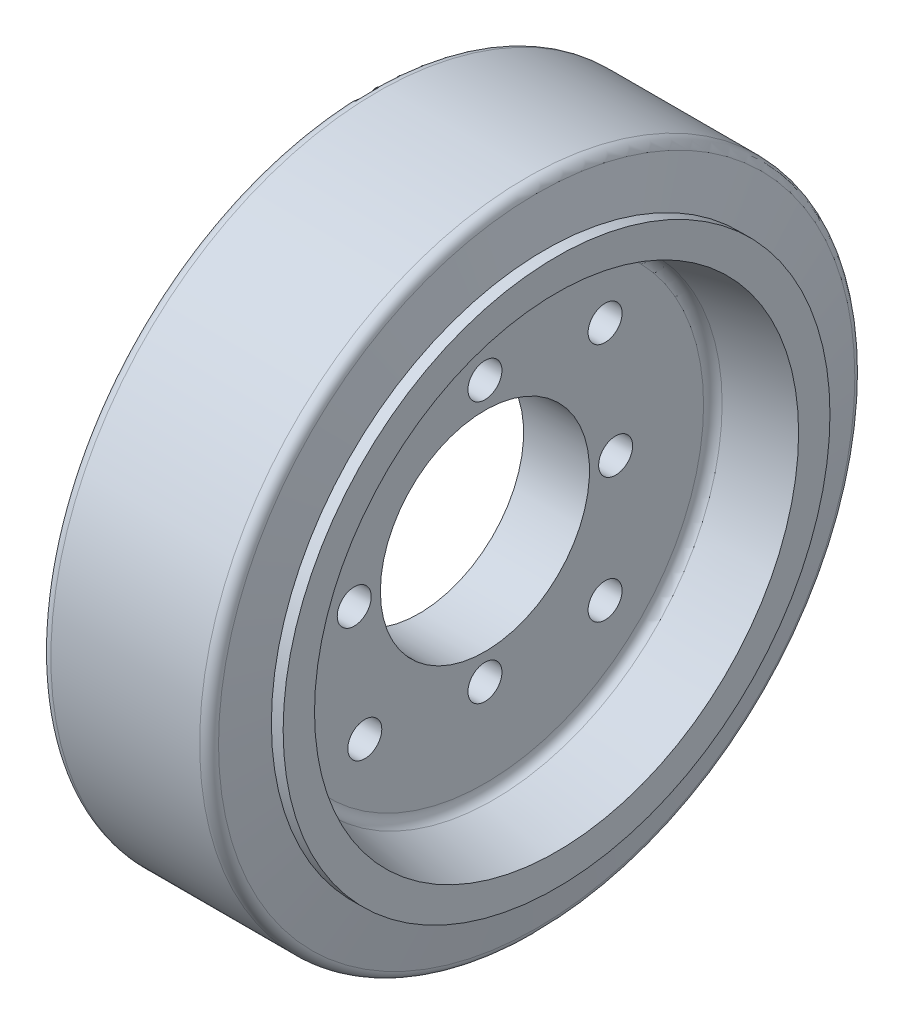
ISO-10303-21;
HEADER;
FILE_DESCRIPTION(('STEP AP214'),'2;1');
FILE_NAME('part.step','',(''),(''),'','','');
FILE_SCHEMA(('AUTOMOTIVE_DESIGN { 1 0 10303 214 1 1 1 1 }'));
ENDSEC;
DATA;
#1=APPLICATION_CONTEXT('core data for automotive mechanical design processes');
#2=APPLICATION_PROTOCOL_DEFINITION('international standard','automotive_design',2000,#1);
#3=PRODUCT_CONTEXT('',#1,'mechanical');
#4=PRODUCT('Part','Part','',(#3));
#5=PRODUCT_RELATED_PRODUCT_CATEGORY('part','',(#4));
#6=PRODUCT_DEFINITION_FORMATION('','',#4);
#7=PRODUCT_DEFINITION_CONTEXT('part definition',#1,'design');
#8=PRODUCT_DEFINITION('design','',#6,#7);
#9=PRODUCT_DEFINITION_SHAPE('','',#8);
#10=(LENGTH_UNIT() NAMED_UNIT(*) SI_UNIT(.MILLI.,.METRE.));
#11=(NAMED_UNIT(*) PLANE_ANGLE_UNIT() SI_UNIT($,.RADIAN.));
#12=(NAMED_UNIT(*) SI_UNIT($,.STERADIAN.) SOLID_ANGLE_UNIT());
#13=UNCERTAINTY_MEASURE_WITH_UNIT(LENGTH_MEASURE(1.E-05),#10,'distance_accuracy_value','');
#14=(GEOMETRIC_REPRESENTATION_CONTEXT(3) GLOBAL_UNCERTAINTY_ASSIGNED_CONTEXT((#13)) GLOBAL_UNIT_ASSIGNED_CONTEXT((#10,
#11,#12)) REPRESENTATION_CONTEXT('',''));
#15=CARTESIAN_POINT('',(0.,0.,0.));
#16=DIRECTION('',(0.,0.,1.));
#17=DIRECTION('',(1.,0.,0.));
#18=AXIS2_PLACEMENT_3D('',#15,#16,#17);
#19=CARTESIAN_POINT('',(15.9,0.,0.));
#20=DIRECTION('',(-1.,0.,0.));
#21=DIRECTION('',(0.,0.,1.));
#22=AXIS2_PLACEMENT_3D('',#19,#20,#21);
#23=CONICAL_SURFACE('',#22,62.5,1.39137423336047);
#24=CARTESIAN_POINT('',(16.1980092545903,0.,0.));
#25=DIRECTION('',(1.,0.,0.));
#26=DIRECTION('',(0.,0.,-1.));
#27=AXIS2_PLACEMENT_3D('',#24,#25,#26);
#28=CIRCLE('',#27,60.8569219476642);
#29=CARTESIAN_POINT('',(16.1980092545903,0.,-60.8569219476642));
#30=VERTEX_POINT('',#29);
#31=EDGE_CURVE('E12',#30,#30,#28,.T.);
#32=ORIENTED_EDGE('',*,*,#31,.T.);
#33=EDGE_LOOP('',(#32));
#34=FACE_BOUND('',#33,.T.);
#35=CARTESIAN_POINT('',(17.75,0.,0.));
#36=DIRECTION('',(-1.,0.,0.));
#37=DIRECTION('',(0.,0.,1.));
#38=AXIS2_PLACEMENT_3D('',#35,#36,#37);
#39=CIRCLE('',#38,52.3);
#40=CARTESIAN_POINT('',(17.75,0.,52.3));
#41=VERTEX_POINT('',#40);
#42=EDGE_CURVE('E91',#41,#41,#39,.T.);
#43=ORIENTED_EDGE('',*,*,#42,.T.);
#44=EDGE_LOOP('',(#43));
#45=FACE_BOUND('',#44,.T.);
#46=ADVANCED_FACE('F52',(#34,#45),#23,.T.);
#47=CARTESIAN_POINT('',(0.,0.,0.));
#48=DIRECTION('',(-1.,0.,0.));
#49=DIRECTION('',(0.,0.,1.));
#50=AXIS2_PLACEMENT_3D('',#47,#48,#49);
#51=CYLINDRICAL_SURFACE('',#50,52.3);
#52=CARTESIAN_POINT('',(20.,0.,0.));
#53=DIRECTION('',(-1.,0.,0.));
#54=DIRECTION('',(0.,0.,1.));
#55=AXIS2_PLACEMENT_3D('',#52,#53,#54);
#56=CIRCLE('',#55,52.3);
#57=CARTESIAN_POINT('',(20.,0.,52.3));
#58=VERTEX_POINT('',#57);
#59=EDGE_CURVE('E95',#58,#58,#56,.T.);
#60=ORIENTED_EDGE('',*,*,#59,.T.);
#61=EDGE_LOOP('',(#60));
#62=FACE_BOUND('',#61,.T.);
#63=ORIENTED_EDGE('',*,*,#42,.F.);
#64=EDGE_LOOP('',(#63));
#65=FACE_BOUND('',#64,.T.);
#66=ADVANCED_FACE('F214',(#62,#65),#51,.T.);
#67=CARTESIAN_POINT('',(20.,-52.3,0.));
#68=DIRECTION('',(1.,0.,0.));
#69=DIRECTION('',(0.,0.,-1.));
#70=AXIS2_PLACEMENT_3D('',#67,#68,#69);
#71=PLANE('',#70);
#72=CARTESIAN_POINT('',(20.,0.,0.));
#73=DIRECTION('',(-1.,0.,0.));
#74=DIRECTION('',(0.,0.,1.));
#75=AXIS2_PLACEMENT_3D('',#72,#73,#74);
#76=CIRCLE('',#75,46.3);
#77=CARTESIAN_POINT('',(20.,0.,46.3));
#78=VERTEX_POINT('',#77);
#79=EDGE_CURVE('E99',#78,#78,#76,.T.);
#80=ORIENTED_EDGE('',*,*,#79,.T.);
#81=EDGE_LOOP('',(#80));
#82=FACE_BOUND('',#81,.T.);
#83=ORIENTED_EDGE('',*,*,#59,.F.);
#84=EDGE_LOOP('',(#83));
#85=FACE_BOUND('',#84,.T.);
#86=ADVANCED_FACE('F220',(#82,#85),#71,.T.);
#87=CARTESIAN_POINT('',(20.,0.,0.));
#88=DIRECTION('',(1.,0.,0.));
#89=DIRECTION('',(0.,0.,-1.));
#90=AXIS2_PLACEMENT_3D('',#87,#88,#89);
#91=CONICAL_SURFACE('',#90,46.3,0.205103886501625);
#92=CARTESIAN_POINT('',(7.89266225994668,0.,0.));
#93=DIRECTION('',(1.,0.,0.));
#94=DIRECTION('',(0.,0.,-1.));
#95=AXIS2_PLACEMENT_3D('',#92,#93,#94);
#96=CIRCLE('',#95,43.7813202511568);
#97=CARTESIAN_POINT('',(7.89266225994668,0.,-43.7813202511568));
#98=VERTEX_POINT('',#97);
#99=EDGE_CURVE('E87',#98,#98,#96,.F.);
#100=ORIENTED_EDGE('',*,*,#99,.T.);
#101=EDGE_LOOP('',(#100));
#102=FACE_BOUND('',#101,.T.);
#103=ORIENTED_EDGE('',*,*,#79,.F.);
#104=EDGE_LOOP('',(#103));
#105=FACE_BOUND('',#104,.T.);
#106=ADVANCED_FACE('F227',(#102,#105),#91,.F.);
#107=CARTESIAN_POINT('',(6.3,-43.45,0.));
#108=DIRECTION('',(1.,0.,0.));
#109=DIRECTION('',(0.,0.,-1.));
#110=AXIS2_PLACEMENT_3D('',#107,#108,#109);
#111=PLANE('',#110);
#112=CARTESIAN_POINT('',(6.3,22.9809703885627,-22.9809703885629));
#113=DIRECTION('',(1.,0.,0.));
#114=DIRECTION('',(0.,0.,-1.));
#115=AXIS2_PLACEMENT_3D('',#112,#113,#114);
#116=CIRCLE('',#115,3.24999999999999);
#117=CARTESIAN_POINT('',(6.3,22.9809703885627,-26.2309703885629));
#118=VERTEX_POINT('',#117);
#119=EDGE_CURVE('E163',#118,#118,#116,.T.);
#120=ORIENTED_EDGE('',*,*,#119,.F.);
#121=EDGE_LOOP('',(#120));
#122=FACE_BOUND('',#121,.T.);
#123=CARTESIAN_POINT('',(6.3,-22.9809703885629,-22.9809703885627));
#124=DIRECTION('',(1.,0.,0.));
#125=DIRECTION('',(0.,0.,-1.));
#126=AXIS2_PLACEMENT_3D('',#123,#124,#125);
#127=CIRCLE('',#126,3.24999999999999);
#128=CARTESIAN_POINT('',(6.3,-22.9809703885629,-26.2309703885627));
#129=VERTEX_POINT('',#128);
#130=EDGE_CURVE('E157',#129,#129,#127,.T.);
#131=ORIENTED_EDGE('',*,*,#130,.F.);
#132=EDGE_LOOP('',(#131));
#133=FACE_BOUND('',#132,.T.);
#134=CARTESIAN_POINT('',(6.3,-22.9809703885627,22.9809703885629));
#135=DIRECTION('',(1.,0.,0.));
#136=DIRECTION('',(0.,0.,-1.));
#137=AXIS2_PLACEMENT_3D('',#134,#135,#136);
#138=CIRCLE('',#137,3.24999999999999);
#139=CARTESIAN_POINT('',(6.3,-22.9809703885627,19.7309703885629));
#140=VERTEX_POINT('',#139);
#141=EDGE_CURVE('E151',#140,#140,#138,.T.);
#142=ORIENTED_EDGE('',*,*,#141,.F.);
#143=EDGE_LOOP('',(#142));
#144=FACE_BOUND('',#143,.T.);
#145=CARTESIAN_POINT('',(6.3,22.9809703885629,22.9809703885627));
#146=DIRECTION('',(1.,0.,0.));
#147=DIRECTION('',(0.,0.,-1.));
#148=AXIS2_PLACEMENT_3D('',#145,#146,#147);
#149=CIRCLE('',#148,3.24999999999999);
#150=CARTESIAN_POINT('',(6.3,22.9809703885629,19.7309703885627));
#151=VERTEX_POINT('',#150);
#152=EDGE_CURVE('E144',#151,#151,#149,.T.);
#153=ORIENTED_EDGE('',*,*,#152,.F.);
#154=EDGE_LOOP('',(#153));
#155=FACE_BOUND('',#154,.T.);
#156=CARTESIAN_POINT('',(6.3,0.,25.));
#157=DIRECTION('',(1.,0.,0.));
#158=DIRECTION('',(0.,0.,-1.));
#159=AXIS2_PLACEMENT_3D('',#156,#157,#158);
#160=CIRCLE('',#159,3.25);
#161=CARTESIAN_POINT('',(6.3,0.,21.75));
#162=VERTEX_POINT('',#161);
#163=EDGE_CURVE('E138',#162,#162,#160,.T.);
#164=ORIENTED_EDGE('',*,*,#163,.F.);
#165=EDGE_LOOP('',(#164));
#166=FACE_BOUND('',#165,.T.);
#167=CARTESIAN_POINT('',(6.3,-25.,0.));
#168=DIRECTION('',(1.,0.,0.));
#169=DIRECTION('',(0.,0.,-1.));
#170=AXIS2_PLACEMENT_3D('',#167,#168,#169);
#171=CIRCLE('',#170,3.25);
#172=CARTESIAN_POINT('',(6.3,-25.,-3.25));
#173=VERTEX_POINT('',#172);
#174=EDGE_CURVE('E132',#173,#173,#171,.T.);
#175=ORIENTED_EDGE('',*,*,#174,.F.);
#176=EDGE_LOOP('',(#175));
#177=FACE_BOUND('',#176,.T.);
#178=CARTESIAN_POINT('',(6.3,0.,-25.));
#179=DIRECTION('',(1.,0.,0.));
#180=DIRECTION('',(0.,0.,-1.));
#181=AXIS2_PLACEMENT_3D('',#178,#179,#180);
#182=CIRCLE('',#181,3.25);
#183=CARTESIAN_POINT('',(6.3,0.,-28.25));
#184=VERTEX_POINT('',#183);
#185=EDGE_CURVE('E125',#184,#184,#182,.T.);
#186=ORIENTED_EDGE('',*,*,#185,.F.);
#187=EDGE_LOOP('',(#186));
#188=FACE_BOUND('',#187,.T.);
#189=CARTESIAN_POINT('',(6.3,25.,0.));
#190=DIRECTION('',(1.,0.,0.));
#191=DIRECTION('',(0.,0.,-1.));
#192=AXIS2_PLACEMENT_3D('',#189,#190,#191);
#193=CIRCLE('',#192,3.25);
#194=CARTESIAN_POINT('',(6.3,25.,-3.25));
#195=VERTEX_POINT('',#194);
#196=EDGE_CURVE('E119',#195,#195,#193,.T.);
#197=ORIENTED_EDGE('',*,*,#196,.F.);
#198=EDGE_LOOP('',(#197));
#199=FACE_BOUND('',#198,.T.);
#200=CARTESIAN_POINT('',(6.3,0.,0.));
#201=DIRECTION('',(1.,0.,0.));
#202=DIRECTION('',(0.,0.,-1.));
#203=AXIS2_PLACEMENT_3D('',#200,#201,#202);
#204=CIRCLE('',#203,20.);
#205=CARTESIAN_POINT('',(6.3,0.,20.));
#206=VERTEX_POINT('',#205);
#207=EDGE_CURVE('E115',#206,#206,#204,.T.);
#208=ORIENTED_EDGE('',*,*,#207,.F.);
#209=EDGE_LOOP('',(#208));
#210=FACE_BOUND('',#209,.T.);
#211=CARTESIAN_POINT('',(6.3,0.,0.));
#212=DIRECTION('',(1.,0.,0.));
#213=DIRECTION('',(0.,0.,-1.));
#214=AXIS2_PLACEMENT_3D('',#211,#212,#213);
#215=CIRCLE('',#214,41.8232405884443);
#216=CARTESIAN_POINT('',(6.3,0.,-41.8232405884443));
#217=VERTEX_POINT('',#216);
#218=EDGE_CURVE('E84',#217,#217,#215,.T.);
#219=ORIENTED_EDGE('',*,*,#218,.T.);
#220=EDGE_LOOP('',(#219));
#221=FACE_BOUND('',#220,.T.);
#222=ADVANCED_FACE('F177',(#122,#133,#144,#155,#166,#177,#188,#199,#210,#221),#111,.T.);
#223=CARTESIAN_POINT('',(-6.3,-43.45,0.));
#224=DIRECTION('',(-1.,0.,0.));
#225=DIRECTION('',(0.,0.,1.));
#226=AXIS2_PLACEMENT_3D('',#223,#224,#225);
#227=PLANE('',#226);
#228=CARTESIAN_POINT('',(-6.3,22.9809703885627,-22.9809703885629));
#229=DIRECTION('',(-1.,0.,0.));
#230=DIRECTION('',(0.,0.,1.));
#231=AXIS2_PLACEMENT_3D('',#228,#229,#230);
#232=CIRCLE('',#231,3.25);
#233=CARTESIAN_POINT('',(-6.3,22.9809703885627,-19.7309703885629));
#234=VERTEX_POINT('',#233);
#235=EDGE_CURVE('E166',#234,#234,#232,.T.);
#236=ORIENTED_EDGE('',*,*,#235,.F.);
#237=EDGE_LOOP('',(#236));
#238=FACE_BOUND('',#237,.T.);
#239=CARTESIAN_POINT('',(-6.3,-22.9809703885629,-22.9809703885627));
#240=DIRECTION('',(-1.,0.,0.));
#241=DIRECTION('',(0.,0.,1.));
#242=AXIS2_PLACEMENT_3D('',#239,#240,#241);
#243=CIRCLE('',#242,3.25);
#244=CARTESIAN_POINT('',(-6.3,-22.9809703885629,-19.7309703885627));
#245=VERTEX_POINT('',#244);
#246=EDGE_CURVE('E160',#245,#245,#243,.T.);
#247=ORIENTED_EDGE('',*,*,#246,.F.);
#248=EDGE_LOOP('',(#247));
#249=FACE_BOUND('',#248,.T.);
#250=CARTESIAN_POINT('',(-6.3,-22.9809703885627,22.9809703885629));
#251=DIRECTION('',(-1.,0.,0.));
#252=DIRECTION('',(0.,0.,1.));
#253=AXIS2_PLACEMENT_3D('',#250,#251,#252);
#254=CIRCLE('',#253,3.25);
#255=CARTESIAN_POINT('',(-6.3,-22.9809703885627,26.2309703885629));
#256=VERTEX_POINT('',#255);
#257=EDGE_CURVE('E154',#256,#256,#254,.T.);
#258=ORIENTED_EDGE('',*,*,#257,.F.);
#259=EDGE_LOOP('',(#258));
#260=FACE_BOUND('',#259,.T.);
#261=CARTESIAN_POINT('',(-6.3,22.9809703885629,22.9809703885627));
#262=DIRECTION('',(-1.,0.,0.));
#263=DIRECTION('',(0.,0.,1.));
#264=AXIS2_PLACEMENT_3D('',#261,#262,#263);
#265=CIRCLE('',#264,3.25);
#266=CARTESIAN_POINT('',(-6.3,22.9809703885629,26.2309703885627));
#267=VERTEX_POINT('',#266);
#268=EDGE_CURVE('E148',#267,#267,#265,.T.);
#269=ORIENTED_EDGE('',*,*,#268,.F.);
#270=EDGE_LOOP('',(#269));
#271=FACE_BOUND('',#270,.T.);
#272=CARTESIAN_POINT('',(-6.3,0.,25.));
#273=DIRECTION('',(-1.,0.,0.));
#274=DIRECTION('',(0.,0.,1.));
#275=AXIS2_PLACEMENT_3D('',#272,#273,#274);
#276=CIRCLE('',#275,3.25);
#277=CARTESIAN_POINT('',(-6.3,0.,28.25));
#278=VERTEX_POINT('',#277);
#279=EDGE_CURVE('E141',#278,#278,#276,.T.);
#280=ORIENTED_EDGE('',*,*,#279,.F.);
#281=EDGE_LOOP('',(#280));
#282=FACE_BOUND('',#281,.T.);
#283=CARTESIAN_POINT('',(-6.3,-25.,0.));
#284=DIRECTION('',(-1.,0.,0.));
#285=DIRECTION('',(0.,0.,1.));
#286=AXIS2_PLACEMENT_3D('',#283,#284,#285);
#287=CIRCLE('',#286,3.25);
#288=CARTESIAN_POINT('',(-6.3,-25.,3.25));
#289=VERTEX_POINT('',#288);
#290=EDGE_CURVE('E135',#289,#289,#287,.T.);
#291=ORIENTED_EDGE('',*,*,#290,.F.);
#292=EDGE_LOOP('',(#291));
#293=FACE_BOUND('',#292,.T.);
#294=CARTESIAN_POINT('',(-6.3,0.,-25.));
#295=DIRECTION('',(-1.,0.,0.));
#296=DIRECTION('',(0.,0.,1.));
#297=AXIS2_PLACEMENT_3D('',#294,#295,#296);
#298=CIRCLE('',#297,3.25);
#299=CARTESIAN_POINT('',(-6.3,0.,-21.75));
#300=VERTEX_POINT('',#299);
#301=EDGE_CURVE('E128',#300,#300,#298,.T.);
#302=ORIENTED_EDGE('',*,*,#301,.F.);
#303=EDGE_LOOP('',(#302));
#304=FACE_BOUND('',#303,.T.);
#305=CARTESIAN_POINT('',(-6.3,25.,0.));
#306=DIRECTION('',(-1.,0.,0.));
#307=DIRECTION('',(0.,0.,1.));
#308=AXIS2_PLACEMENT_3D('',#305,#306,#307);
#309=CIRCLE('',#308,3.25);
#310=CARTESIAN_POINT('',(-6.3,25.,3.25));
#311=VERTEX_POINT('',#310);
#312=EDGE_CURVE('E122',#311,#311,#309,.T.);
#313=ORIENTED_EDGE('',*,*,#312,.F.);
#314=EDGE_LOOP('',(#313));
#315=FACE_BOUND('',#314,.T.);
#316=CARTESIAN_POINT('',(-6.3,0.,0.));
#317=DIRECTION('',(-1.,0.,0.));
#318=DIRECTION('',(0.,0.,1.));
#319=AXIS2_PLACEMENT_3D('',#316,#317,#318);
#320=CIRCLE('',#319,20.);
#321=CARTESIAN_POINT('',(-6.3,0.,20.));
#322=VERTEX_POINT('',#321);
#323=EDGE_CURVE('E56',#322,#322,#320,.T.);
#324=ORIENTED_EDGE('',*,*,#323,.F.);
#325=EDGE_LOOP('',(#324));
#326=FACE_BOUND('',#325,.T.);
#327=CARTESIAN_POINT('',(-6.3,0.,0.));
#328=DIRECTION('',(-1.,0.,0.));
#329=DIRECTION('',(0.,0.,1.));
#330=AXIS2_PLACEMENT_3D('',#327,#328,#329);
#331=CIRCLE('',#330,41.8232405884443);
#332=CARTESIAN_POINT('',(-6.3,0.,41.8232405884443));
#333=VERTEX_POINT('',#332);
#334=EDGE_CURVE('E80',#333,#333,#331,.T.);
#335=ORIENTED_EDGE('',*,*,#334,.T.);
#336=EDGE_LOOP('',(#335));
#337=FACE_BOUND('',#336,.T.);
#338=ADVANCED_FACE('F173',(#238,#249,#260,#271,#282,#293,#304,#315,#326,#337),#227,.T.);
#339=CARTESIAN_POINT('',(-6.3,0.,0.));
#340=DIRECTION('',(-1.,0.,0.));
#341=DIRECTION('',(0.,0.,1.));
#342=AXIS2_PLACEMENT_3D('',#339,#340,#341);
#343=CONICAL_SURFACE('',#342,43.45,0.205103886501625);
#344=CARTESIAN_POINT('',(-7.89266225994668,0.,0.));
#345=DIRECTION('',(-1.,0.,0.));
#346=DIRECTION('',(0.,0.,1.));
#347=AXIS2_PLACEMENT_3D('',#344,#345,#346);
#348=CIRCLE('',#347,43.7813202511568);
#349=CARTESIAN_POINT('',(-7.89266225994668,0.,43.7813202511568));
#350=VERTEX_POINT('',#349);
#351=EDGE_CURVE('E76',#350,#350,#348,.F.);
#352=ORIENTED_EDGE('',*,*,#351,.T.);
#353=EDGE_LOOP('',(#352));
#354=FACE_BOUND('',#353,.T.);
#355=CARTESIAN_POINT('',(-20.,0.,0.));
#356=DIRECTION('',(-1.,0.,0.));
#357=DIRECTION('',(0.,0.,1.));
#358=AXIS2_PLACEMENT_3D('',#355,#356,#357);
#359=CIRCLE('',#358,46.3);
#360=CARTESIAN_POINT('',(-20.,0.,46.3));
#361=VERTEX_POINT('',#360);
#362=EDGE_CURVE('E103',#361,#361,#359,.T.);
#363=ORIENTED_EDGE('',*,*,#362,.T.);
#364=EDGE_LOOP('',(#363));
#365=FACE_BOUND('',#364,.T.);
#366=ADVANCED_FACE('F176',(#354,#365),#343,.F.);
#367=CARTESIAN_POINT('',(-20.,-52.3,0.));
#368=DIRECTION('',(-1.,0.,0.));
#369=DIRECTION('',(0.,0.,1.));
#370=AXIS2_PLACEMENT_3D('',#367,#368,#369);
#371=PLANE('',#370);
#372=CARTESIAN_POINT('',(-20.,0.,0.));
#373=DIRECTION('',(-1.,0.,0.));
#374=DIRECTION('',(0.,0.,1.));
#375=AXIS2_PLACEMENT_3D('',#372,#373,#374);
#376=CIRCLE('',#375,52.3);
#377=CARTESIAN_POINT('',(-20.,0.,52.3));
#378=VERTEX_POINT('',#377);
#379=EDGE_CURVE('E107',#378,#378,#376,.T.);
#380=ORIENTED_EDGE('',*,*,#379,.T.);
#381=EDGE_LOOP('',(#380));
#382=FACE_BOUND('',#381,.T.);
#383=ORIENTED_EDGE('',*,*,#362,.F.);
#384=EDGE_LOOP('',(#383));
#385=FACE_BOUND('',#384,.T.);
#386=ADVANCED_FACE('F236',(#382,#385),#371,.T.);
#387=CARTESIAN_POINT('',(0.,0.,0.));
#388=DIRECTION('',(-1.,0.,0.));
#389=DIRECTION('',(0.,0.,1.));
#390=AXIS2_PLACEMENT_3D('',#387,#388,#389);
#391=CYLINDRICAL_SURFACE('',#390,52.3);
#392=CARTESIAN_POINT('',(-17.75,0.,0.));
#393=DIRECTION('',(-1.,0.,0.));
#394=DIRECTION('',(0.,0.,1.));
#395=AXIS2_PLACEMENT_3D('',#392,#393,#394);
#396=CIRCLE('',#395,52.3);
#397=CARTESIAN_POINT('',(-17.75,0.,52.3));
#398=VERTEX_POINT('',#397);
#399=EDGE_CURVE('E111',#398,#398,#396,.T.);
#400=ORIENTED_EDGE('',*,*,#399,.T.);
#401=EDGE_LOOP('',(#400));
#402=FACE_BOUND('',#401,.T.);
#403=ORIENTED_EDGE('',*,*,#379,.F.);
#404=EDGE_LOOP('',(#403));
#405=FACE_BOUND('',#404,.T.);
#406=ADVANCED_FACE('F240',(#402,#405),#391,.T.);
#407=CARTESIAN_POINT('',(-17.75,0.,0.));
#408=DIRECTION('',(1.,0.,0.));
#409=DIRECTION('',(0.,0.,-1.));
#410=AXIS2_PLACEMENT_3D('',#407,#408,#409);
#411=CONICAL_SURFACE('',#410,52.3,1.39137423336047);
#412=CARTESIAN_POINT('',(-16.1980092545903,0.,0.));
#413=DIRECTION('',(-1.,0.,0.));
#414=DIRECTION('',(0.,0.,1.));
#415=AXIS2_PLACEMENT_3D('',#412,#413,#414);
#416=CIRCLE('',#415,60.8569219476642);
#417=CARTESIAN_POINT('',(-16.1980092545903,0.,60.8569219476642));
#418=VERTEX_POINT('',#417);
#419=EDGE_CURVE('E72',#418,#418,#416,.T.);
#420=ORIENTED_EDGE('',*,*,#419,.T.);
#421=EDGE_LOOP('',(#420));
#422=FACE_BOUND('',#421,.T.);
#423=ORIENTED_EDGE('',*,*,#399,.F.);
#424=EDGE_LOOP('',(#423));
#425=FACE_BOUND('',#424,.T.);
#426=ADVANCED_FACE('F244',(#422,#425),#411,.T.);
#427=CARTESIAN_POINT('',(0.,0.,0.));
#428=DIRECTION('',(-1.,0.,0.));
#429=DIRECTION('',(0.,0.,1.));
#430=AXIS2_PLACEMENT_3D('',#427,#428,#429);
#431=CYLINDRICAL_SURFACE('',#430,62.5);
#432=CARTESIAN_POINT('',(-14.2301152728739,0.,0.));
#433=DIRECTION('',(1.,0.,0.));
#434=DIRECTION('',(0.,0.,-1.));
#435=AXIS2_PLACEMENT_3D('',#432,#433,#434);
#436=CIRCLE('',#435,62.5);
#437=CARTESIAN_POINT('',(-14.2301152728739,0.,-62.5));
#438=VERTEX_POINT('',#437);
#439=EDGE_CURVE('E61',#438,#438,#436,.T.);
#440=ORIENTED_EDGE('',*,*,#439,.T.);
#441=EDGE_LOOP('',(#440));
#442=FACE_BOUND('',#441,.T.);
#443=CARTESIAN_POINT('',(14.2301152728739,0.,0.));
#444=DIRECTION('',(1.,0.,0.));
#445=DIRECTION('',(0.,0.,-1.));
#446=AXIS2_PLACEMENT_3D('',#443,#444,#445);
#447=CIRCLE('',#446,62.5);
#448=CARTESIAN_POINT('',(14.2301152728739,0.,-62.5));
#449=VERTEX_POINT('',#448);
#450=EDGE_CURVE('E67',#449,#449,#447,.F.);
#451=ORIENTED_EDGE('',*,*,#450,.T.);
#452=EDGE_LOOP('',(#451));
#453=FACE_BOUND('',#452,.T.);
#454=ADVANCED_FACE('F209',(#442,#453),#431,.T.);
#455=CARTESIAN_POINT('',(8.3,0.,0.));
#456=DIRECTION('',(1.,0.,0.));
#457=DIRECTION('',(0.,0.,-1.));
#458=AXIS2_PLACEMENT_3D('',#455,#456,#457);
#459=TOROIDAL_SURFACE('',#458,41.8232405884443,2.);
#460=ORIENTED_EDGE('',*,*,#218,.F.);
#461=EDGE_LOOP('',(#460));
#462=FACE_BOUND('',#461,.T.);
#463=ORIENTED_EDGE('',*,*,#99,.F.);
#464=EDGE_LOOP('',(#463));
#465=FACE_BOUND('',#464,.T.);
#466=ADVANCED_FACE('F201',(#462,#465),#459,.F.);
#467=CARTESIAN_POINT('',(-8.3,0.,0.));
#468=DIRECTION('',(-1.,0.,0.));
#469=DIRECTION('',(0.,0.,1.));
#470=AXIS2_PLACEMENT_3D('',#467,#468,#469);
#471=TOROIDAL_SURFACE('',#470,41.8232405884443,2.);
#472=ORIENTED_EDGE('',*,*,#351,.F.);
#473=EDGE_LOOP('',(#472));
#474=FACE_BOUND('',#473,.T.);
#475=ORIENTED_EDGE('',*,*,#334,.F.);
#476=EDGE_LOOP('',(#475));
#477=FACE_BOUND('',#476,.T.);
#478=ADVANCED_FACE('F198',(#474,#477),#471,.F.);
#479=CARTESIAN_POINT('',(-14.2301152728739,0.,0.));
#480=DIRECTION('',(1.,0.,0.));
#481=DIRECTION('',(0.,0.,-1.));
#482=AXIS2_PLACEMENT_3D('',#479,#480,#481);
#483=TOROIDAL_SURFACE('',#482,60.5,2.);
#484=ORIENTED_EDGE('',*,*,#439,.F.);
#485=EDGE_LOOP('',(#484));
#486=FACE_BOUND('',#485,.T.);
#487=ORIENTED_EDGE('',*,*,#419,.F.);
#488=EDGE_LOOP('',(#487));
#489=FACE_BOUND('',#488,.T.);
#490=ADVANCED_FACE('F200',(#486,#489),#483,.T.);
#491=CARTESIAN_POINT('',(14.2301152728739,0.,0.));
#492=DIRECTION('',(1.,0.,0.));
#493=DIRECTION('',(0.,0.,-1.));
#494=AXIS2_PLACEMENT_3D('',#491,#492,#493);
#495=TOROIDAL_SURFACE('',#494,60.5,2.);
#496=ORIENTED_EDGE('',*,*,#31,.F.);
#497=EDGE_LOOP('',(#496));
#498=FACE_BOUND('',#497,.T.);
#499=ORIENTED_EDGE('',*,*,#450,.F.);
#500=EDGE_LOOP('',(#499));
#501=FACE_BOUND('',#500,.T.);
#502=ADVANCED_FACE('F54',(#498,#501),#495,.T.);
#503=CARTESIAN_POINT('',(22.2,0.,0.));
#504=DIRECTION('',(-1.,0.,0.));
#505=DIRECTION('',(0.,0.,1.));
#506=AXIS2_PLACEMENT_3D('',#503,#504,#505);
#507=CYLINDRICAL_SURFACE('',#506,20.);
#508=CARTESIAN_POINT('',(6.3,0.,20.));
#509=CARTESIAN_POINT('',(6.16875,0.,20.));
#510=CARTESIAN_POINT('',(6.0375,0.,20.));
#511=CARTESIAN_POINT('',(5.775,0.,20.));
#512=CARTESIAN_POINT('',(5.64375,0.,20.));
#513=CARTESIAN_POINT('',(5.38125,0.,20.));
#514=CARTESIAN_POINT('',(5.25,0.,20.));
#515=CARTESIAN_POINT('',(4.9875,0.,20.));
#516=CARTESIAN_POINT('',(4.85625,0.,20.));
#517=CARTESIAN_POINT('',(4.59375,0.,20.));
#518=CARTESIAN_POINT('',(4.4625,0.,20.));
#519=CARTESIAN_POINT('',(4.2,0.,20.));
#520=CARTESIAN_POINT('',(4.06875,0.,20.));
#521=CARTESIAN_POINT('',(3.80625,0.,20.));
#522=CARTESIAN_POINT('',(3.675,0.,20.));
#523=CARTESIAN_POINT('',(3.4125,0.,20.));
#524=CARTESIAN_POINT('',(3.28125,0.,20.));
#525=CARTESIAN_POINT('',(3.01875,0.,20.));
#526=CARTESIAN_POINT('',(2.8875,0.,20.));
#527=CARTESIAN_POINT('',(2.625,0.,20.));
#528=CARTESIAN_POINT('',(2.49375,0.,20.));
#529=CARTESIAN_POINT('',(2.23125,0.,20.));
#530=CARTESIAN_POINT('',(2.1,0.,20.));
#531=CARTESIAN_POINT('',(1.8375,0.,20.));
#532=CARTESIAN_POINT('',(1.70625,0.,20.));
#533=CARTESIAN_POINT('',(1.44375,0.,20.));
#534=CARTESIAN_POINT('',(1.3125,0.,20.));
#535=CARTESIAN_POINT('',(1.05,0.,20.));
#536=CARTESIAN_POINT('',(0.918750000000001,0.,20.));
#537=CARTESIAN_POINT('',(0.656249999999999,0.,20.));
#538=CARTESIAN_POINT('',(0.524999999999999,0.,20.));
#539=CARTESIAN_POINT('',(0.262499999999999,0.,20.));
#540=CARTESIAN_POINT('',(0.131249999999999,0.,20.));
#541=CARTESIAN_POINT('',(-0.131249999999999,0.,20.));
#542=CARTESIAN_POINT('',(-0.262499999999999,0.,20.));
#543=CARTESIAN_POINT('',(-0.524999999999999,0.,20.));
#544=CARTESIAN_POINT('',(-0.656249999999999,0.,20.));
#545=CARTESIAN_POINT('',(-0.918750000000001,0.,20.));
#546=CARTESIAN_POINT('',(-1.05,0.,20.));
#547=CARTESIAN_POINT('',(-1.3125,0.,20.));
#548=CARTESIAN_POINT('',(-1.44375,0.,20.));
#549=CARTESIAN_POINT('',(-1.70625,0.,20.));
#550=CARTESIAN_POINT('',(-1.8375,0.,20.));
#551=CARTESIAN_POINT('',(-2.1,0.,20.));
#552=CARTESIAN_POINT('',(-2.23125,0.,20.));
#553=CARTESIAN_POINT('',(-2.49375,0.,20.));
#554=CARTESIAN_POINT('',(-2.625,0.,20.));
#555=CARTESIAN_POINT('',(-2.8875,0.,20.));
#556=CARTESIAN_POINT('',(-3.01875,0.,20.));
#557=CARTESIAN_POINT('',(-3.28125,0.,20.));
#558=CARTESIAN_POINT('',(-3.4125,0.,20.));
#559=CARTESIAN_POINT('',(-3.675,0.,20.));
#560=CARTESIAN_POINT('',(-3.80625,0.,20.));
#561=CARTESIAN_POINT('',(-4.06875,0.,20.));
#562=CARTESIAN_POINT('',(-4.2,0.,20.));
#563=CARTESIAN_POINT('',(-4.4625,0.,20.));
#564=CARTESIAN_POINT('',(-4.59375,0.,20.));
#565=CARTESIAN_POINT('',(-4.85625,0.,20.));
#566=CARTESIAN_POINT('',(-4.9875,0.,20.));
#567=CARTESIAN_POINT('',(-5.25,0.,20.));
#568=CARTESIAN_POINT('',(-5.38125,0.,20.));
#569=CARTESIAN_POINT('',(-5.64375,0.,20.));
#570=CARTESIAN_POINT('',(-5.775,0.,20.));
#571=CARTESIAN_POINT('',(-6.0375,0.,20.));
#572=CARTESIAN_POINT('',(-6.16875,0.,20.));
#573=CARTESIAN_POINT('',(-6.3,0.,20.));
#574=B_SPLINE_CURVE_WITH_KNOTS('',3,(#508,#509,#510,#511,#512,#513,#514,#515,#516,#517,#518,
#519,#520,#521,#522,#523,#524,#525,#526,#527,#528,#529,#530,#531,#532,#533,#534,#535,#536,#537,
#538,#539,#540,#541,#542,#543,#544,#545,#546,#547,#548,#549,#550,#551,#552,#553,#554,#555,#556,
#557,#558,#559,#560,#561,#562,#563,#564,#565,#566,#567,#568,#569,#570,#571,#572,#573),
.UNSPECIFIED.,.F.,.F.,(4,2,2,2,2,2,2,2,2,2,2,2,2,2,2,2,2,2,2,2,2,2,2,2,2,2,2,2,2,2,2,2,4),(0.,
0.393749999999998,0.7875,1.18125,1.575,1.96875,2.3625,2.75625,3.15,3.54375,3.9375,4.33125,4.725,
5.11875,5.5125,5.90625,6.3,6.69375,7.0875,7.48125,7.875,8.26875,8.6625,9.05625,9.45,9.84375,
10.2375,10.63125,11.025,11.41875,11.8125,12.20625,12.6),.UNSPECIFIED.);
#575=EDGE_CURVE('BSEAM252',#206,#322,#574,.T.);
#576=ORIENTED_EDGE('',*,*,#207,.T.);
#577=ORIENTED_EDGE('',*,*,#323,.T.);
#578=ORIENTED_EDGE('',*,*,#575,.T.);
#579=ORIENTED_EDGE('',*,*,#575,.F.);
#580=EDGE_LOOP('',(#576,#578,#577,#579));
#581=FACE_BOUND('',#580,.T.);
#582=ADVANCED_FACE('F252',(#581),#507,.F.);
#583=CARTESIAN_POINT('',(20.,25.,0.));
#584=DIRECTION('',(-1.,0.,0.));
#585=DIRECTION('',(0.,0.,1.));
#586=AXIS2_PLACEMENT_3D('',#583,#584,#585);
#587=CYLINDRICAL_SURFACE('',#586,3.25);
#588=ORIENTED_EDGE('',*,*,#196,.T.);
#589=EDGE_LOOP('',(#588));
#590=FACE_BOUND('',#589,.T.);
#591=ORIENTED_EDGE('',*,*,#312,.T.);
#592=EDGE_LOOP('',(#591));
#593=FACE_BOUND('',#592,.T.);
#594=ADVANCED_FACE('F254',(#590,#593),#587,.F.);
#595=CARTESIAN_POINT('',(20.,0.,-25.));
#596=DIRECTION('',(-1.,0.,0.));
#597=DIRECTION('',(0.,0.,1.));
#598=AXIS2_PLACEMENT_3D('',#595,#596,#597);
#599=CYLINDRICAL_SURFACE('',#598,3.25);
#600=ORIENTED_EDGE('',*,*,#185,.T.);
#601=EDGE_LOOP('',(#600));
#602=FACE_BOUND('',#601,.T.);
#603=ORIENTED_EDGE('',*,*,#301,.T.);
#604=EDGE_LOOP('',(#603));
#605=FACE_BOUND('',#604,.T.);
#606=ADVANCED_FACE('F258',(#602,#605),#599,.F.);
#607=CARTESIAN_POINT('',(20.,-25.,0.));
#608=DIRECTION('',(-1.,0.,0.));
#609=DIRECTION('',(0.,0.,1.));
#610=AXIS2_PLACEMENT_3D('',#607,#608,#609);
#611=CYLINDRICAL_SURFACE('',#610,3.25);
#612=ORIENTED_EDGE('',*,*,#174,.T.);
#613=EDGE_LOOP('',(#612));
#614=FACE_BOUND('',#613,.T.);
#615=ORIENTED_EDGE('',*,*,#290,.T.);
#616=EDGE_LOOP('',(#615));
#617=FACE_BOUND('',#616,.T.);
#618=ADVANCED_FACE('F262',(#614,#617),#611,.F.);
#619=CARTESIAN_POINT('',(20.,0.,25.));
#620=DIRECTION('',(-1.,0.,0.));
#621=DIRECTION('',(0.,0.,1.));
#622=AXIS2_PLACEMENT_3D('',#619,#620,#621);
#623=CYLINDRICAL_SURFACE('',#622,3.25);
#624=ORIENTED_EDGE('',*,*,#163,.T.);
#625=EDGE_LOOP('',(#624));
#626=FACE_BOUND('',#625,.T.);
#627=ORIENTED_EDGE('',*,*,#279,.T.);
#628=EDGE_LOOP('',(#627));
#629=FACE_BOUND('',#628,.T.);
#630=ADVANCED_FACE('F266',(#626,#629),#623,.F.);
#631=CARTESIAN_POINT('',(-6.3,22.9809703885629,22.9809703885627));
#632=DIRECTION('',(-1.,0.,0.));
#633=DIRECTION('',(0.,0.,1.));
#634=AXIS2_PLACEMENT_3D('',#631,#632,#633);
#635=CYLINDRICAL_SURFACE('',#634,3.24999999999999);
#636=ORIENTED_EDGE('',*,*,#152,.T.);
#637=EDGE_LOOP('',(#636));
#638=FACE_BOUND('',#637,.T.);
#639=ORIENTED_EDGE('',*,*,#268,.T.);
#640=EDGE_LOOP('',(#639));
#641=FACE_BOUND('',#640,.T.);
#642=ADVANCED_FACE('F270',(#638,#641),#635,.F.);
#643=CARTESIAN_POINT('',(-6.3,-22.9809703885627,22.9809703885629));
#644=DIRECTION('',(-1.,0.,0.));
#645=DIRECTION('',(0.,0.,1.));
#646=AXIS2_PLACEMENT_3D('',#643,#644,#645);
#647=CYLINDRICAL_SURFACE('',#646,3.24999999999999);
#648=ORIENTED_EDGE('',*,*,#141,.T.);
#649=EDGE_LOOP('',(#648));
#650=FACE_BOUND('',#649,.T.);
#651=ORIENTED_EDGE('',*,*,#257,.T.);
#652=EDGE_LOOP('',(#651));
#653=FACE_BOUND('',#652,.T.);
#654=ADVANCED_FACE('F274',(#650,#653),#647,.F.);
#655=CARTESIAN_POINT('',(-6.3,-22.9809703885629,-22.9809703885627));
#656=DIRECTION('',(-1.,0.,0.));
#657=DIRECTION('',(0.,0.,1.));
#658=AXIS2_PLACEMENT_3D('',#655,#656,#657);
#659=CYLINDRICAL_SURFACE('',#658,3.24999999999999);
#660=ORIENTED_EDGE('',*,*,#130,.T.);
#661=EDGE_LOOP('',(#660));
#662=FACE_BOUND('',#661,.T.);
#663=ORIENTED_EDGE('',*,*,#246,.T.);
#664=EDGE_LOOP('',(#663));
#665=FACE_BOUND('',#664,.T.);
#666=ADVANCED_FACE('F278',(#662,#665),#659,.F.);
#667=CARTESIAN_POINT('',(-6.3,22.9809703885627,-22.9809703885629));
#668=DIRECTION('',(-1.,0.,0.));
#669=DIRECTION('',(0.,0.,1.));
#670=AXIS2_PLACEMENT_3D('',#667,#668,#669);
#671=CYLINDRICAL_SURFACE('',#670,3.24999999999999);
#672=ORIENTED_EDGE('',*,*,#119,.T.);
#673=EDGE_LOOP('',(#672));
#674=FACE_BOUND('',#673,.T.);
#675=ORIENTED_EDGE('',*,*,#235,.T.);
#676=EDGE_LOOP('',(#675));
#677=FACE_BOUND('',#676,.T.);
#678=ADVANCED_FACE('F171',(#674,#677),#671,.F.);
#679=CLOSED_SHELL('',(#46,#66,#86,#106,#222,#338,#366,#386,#406,#426,#454,#466,#478,#490,#502,
#582,#594,#606,#618,#630,#642,#654,#666,#678));
#680=MANIFOLD_SOLID_BREP('B2',#679);
#681=ADVANCED_BREP_SHAPE_REPRESENTATION('',(#18,#680),#14);
#682=SHAPE_DEFINITION_REPRESENTATION(#9,#681);
ENDSEC;
END-ISO-10303-21;
